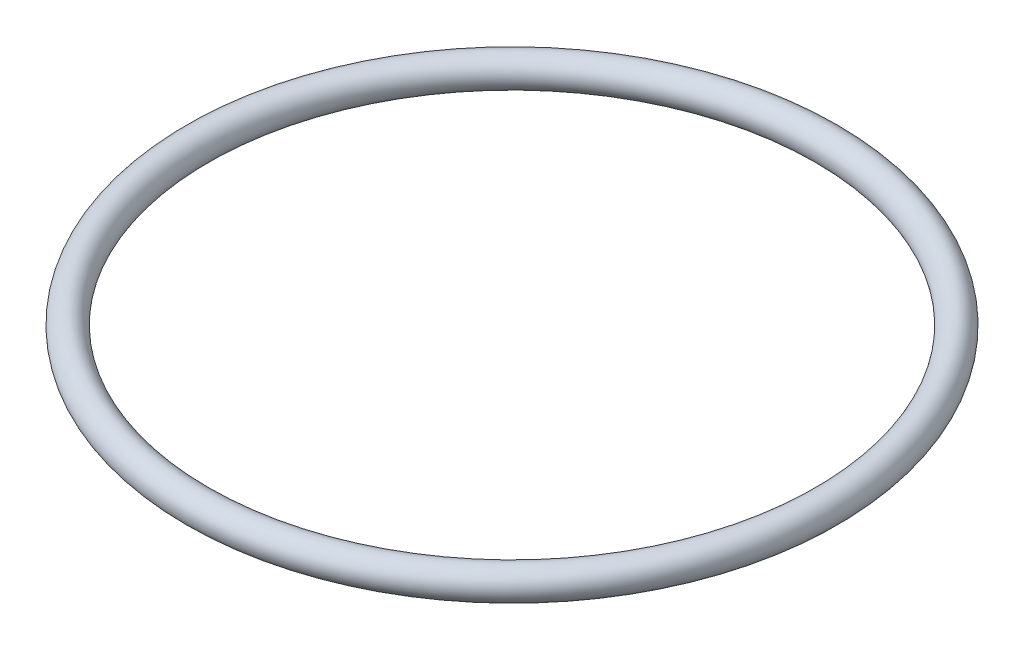
ISO-10303-21;
HEADER;
FILE_DESCRIPTION(('STEP AP214'),'2;1');
FILE_NAME('part.step','',(''),(''),'','','');
FILE_SCHEMA(('AUTOMOTIVE_DESIGN { 1 0 10303 214 1 1 1 1 }'));
ENDSEC;
DATA;
#1=APPLICATION_CONTEXT('core data for automotive mechanical design processes');
#2=APPLICATION_PROTOCOL_DEFINITION('international standard','automotive_design',2000,#1);
#3=PRODUCT_CONTEXT('',#1,'mechanical');
#4=PRODUCT('Part','Part','',(#3));
#5=PRODUCT_RELATED_PRODUCT_CATEGORY('part','',(#4));
#6=PRODUCT_DEFINITION_FORMATION('','',#4);
#7=PRODUCT_DEFINITION_CONTEXT('part definition',#1,'design');
#8=PRODUCT_DEFINITION('design','',#6,#7);
#9=PRODUCT_DEFINITION_SHAPE('','',#8);
#10=(LENGTH_UNIT() NAMED_UNIT(*) SI_UNIT(.MILLI.,.METRE.));
#11=(NAMED_UNIT(*) PLANE_ANGLE_UNIT() SI_UNIT($,.RADIAN.));
#12=(NAMED_UNIT(*) SI_UNIT($,.STERADIAN.) SOLID_ANGLE_UNIT());
#13=UNCERTAINTY_MEASURE_WITH_UNIT(LENGTH_MEASURE(1.E-05),#10,'distance_accuracy_value','');
#14=(GEOMETRIC_REPRESENTATION_CONTEXT(3) GLOBAL_UNCERTAINTY_ASSIGNED_CONTEXT((#13)) GLOBAL_UNIT_ASSIGNED_CONTEXT((#10,
#11,#12)) REPRESENTATION_CONTEXT('',''));
#15=CARTESIAN_POINT('',(0.,0.,0.));
#16=DIRECTION('',(0.,0.,1.));
#17=DIRECTION('',(1.,0.,0.));
#18=AXIS2_PLACEMENT_3D('',#15,#16,#17);
#19=CARTESIAN_POINT('',(0.,0.,0.));
#20=DIRECTION('',(0.,-1.,0.));
#21=DIRECTION('',(0.,0.,-1.));
#22=AXIS2_PLACEMENT_3D('',#19,#20,#21);
#23=TOROIDAL_SURFACE('',#22,20.5,1.);
#24=CARTESIAN_POINT('',(0.,0.,-21.5));
#25=VERTEX_POINT('',#24);
#26=VERTEX_LOOP('',#25);
#27=FACE_BOUND('',#26,.T.);
#28=ADVANCED_FACE('F34',(#27),#23,.T.);
#29=CLOSED_SHELL('',(#28));
#30=MANIFOLD_SOLID_BREP('B2',#29);
#31=ADVANCED_BREP_SHAPE_REPRESENTATION('',(#18,#30),#14);
#32=SHAPE_DEFINITION_REPRESENTATION(#9,#31);
ENDSEC;
END-ISO-10303-21;
